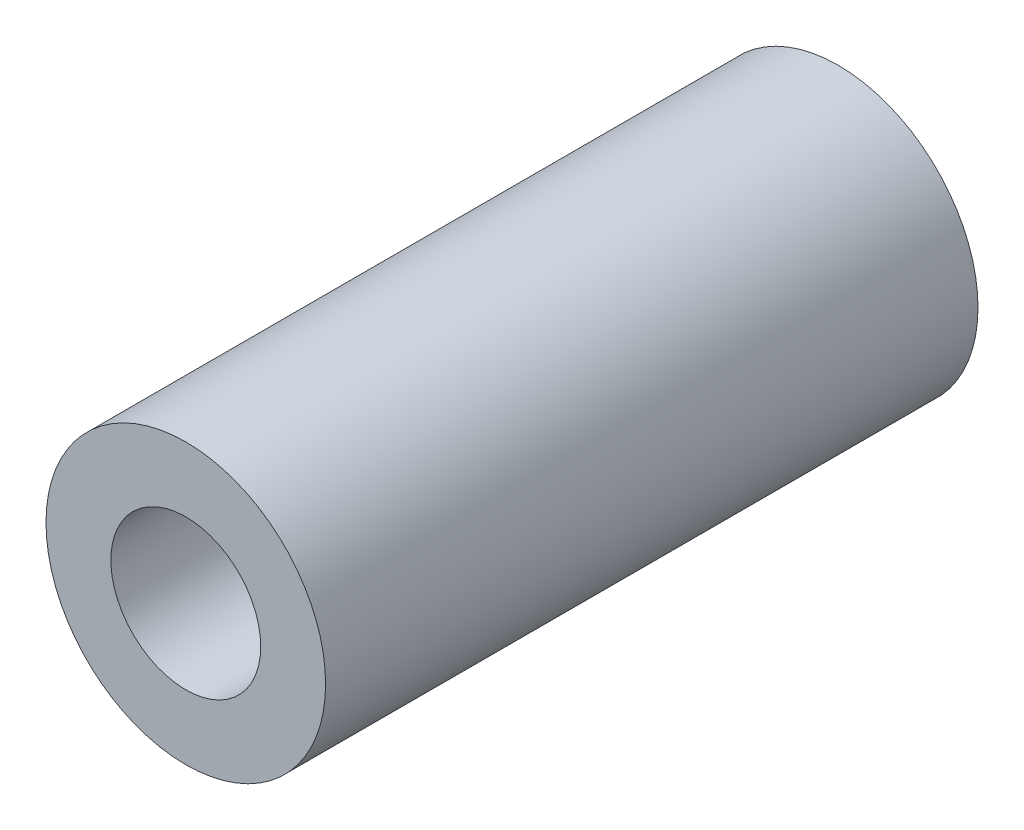
ISO-10303-21;
HEADER;
FILE_DESCRIPTION(('STEP AP214'),'2;1');
FILE_NAME('part.step','',(''),(''),'','','');
FILE_SCHEMA(('AUTOMOTIVE_DESIGN { 1 0 10303 214 1 1 1 1 }'));
ENDSEC;
DATA;
#1=APPLICATION_CONTEXT('core data for automotive mechanical design processes');
#2=APPLICATION_PROTOCOL_DEFINITION('international standard','automotive_design',2000,#1);
#3=PRODUCT_CONTEXT('',#1,'mechanical');
#4=PRODUCT('Part','Part','',(#3));
#5=PRODUCT_RELATED_PRODUCT_CATEGORY('part','',(#4));
#6=PRODUCT_DEFINITION_FORMATION('','',#4);
#7=PRODUCT_DEFINITION_CONTEXT('part definition',#1,'design');
#8=PRODUCT_DEFINITION('design','',#6,#7);
#9=PRODUCT_DEFINITION_SHAPE('','',#8);
#10=(LENGTH_UNIT() NAMED_UNIT(*) SI_UNIT(.MILLI.,.METRE.));
#11=(NAMED_UNIT(*) PLANE_ANGLE_UNIT() SI_UNIT($,.RADIAN.));
#12=(NAMED_UNIT(*) SI_UNIT($,.STERADIAN.) SOLID_ANGLE_UNIT());
#13=UNCERTAINTY_MEASURE_WITH_UNIT(LENGTH_MEASURE(1.E-05),#10,'distance_accuracy_value','');
#14=(GEOMETRIC_REPRESENTATION_CONTEXT(3) GLOBAL_UNCERTAINTY_ASSIGNED_CONTEXT((#13)) GLOBAL_UNIT_ASSIGNED_CONTEXT((#10,
#11,#12)) REPRESENTATION_CONTEXT('',''));
#15=CARTESIAN_POINT('',(0.,0.,0.));
#16=DIRECTION('',(0.,0.,1.));
#17=DIRECTION('',(1.,0.,0.));
#18=AXIS2_PLACEMENT_3D('',#15,#16,#17);
#19=CARTESIAN_POINT('',(0.,0.,22.225));
#20=DIRECTION('',(0.,0.,-1.));
#21=DIRECTION('',(-1.,0.,0.));
#22=AXIS2_PLACEMENT_3D('',#19,#20,#21);
#23=CYLINDRICAL_SURFACE('',#22,4.7625);
#24=CARTESIAN_POINT('',(0.,0.,22.225));
#25=DIRECTION('',(0.,0.,1.));
#26=DIRECTION('',(1.,0.,0.));
#27=AXIS2_PLACEMENT_3D('',#24,#25,#26);
#28=CIRCLE('',#27,4.7625);
#29=CARTESIAN_POINT('',(4.7625,0.,22.225));
#30=VERTEX_POINT('',#29);
#31=EDGE_CURVE('E10',#30,#30,#28,.T.);
#32=ORIENTED_EDGE('',*,*,#31,.F.);
#33=EDGE_LOOP('',(#32));
#34=FACE_BOUND('',#33,.T.);
#35=CARTESIAN_POINT('',(0.,0.,0.));
#36=DIRECTION('',(0.,0.,1.));
#37=DIRECTION('',(1.,0.,0.));
#38=AXIS2_PLACEMENT_3D('',#35,#36,#37);
#39=CIRCLE('',#38,4.7625);
#40=CARTESIAN_POINT('',(4.7625,0.,0.));
#41=VERTEX_POINT('',#40);
#42=EDGE_CURVE('E34',#41,#41,#39,.T.);
#43=ORIENTED_EDGE('',*,*,#42,.T.);
#44=EDGE_LOOP('',(#43));
#45=FACE_BOUND('',#44,.T.);
#46=ADVANCED_FACE('F31',(#34,#45),#23,.T.);
#47=CARTESIAN_POINT('',(0.,0.,22.225));
#48=DIRECTION('',(0.,0.,1.));
#49=DIRECTION('',(1.,0.,0.));
#50=AXIS2_PLACEMENT_3D('',#47,#48,#49);
#51=PLANE('',#50);
#52=CARTESIAN_POINT('',(0.,0.,22.225));
#53=DIRECTION('',(0.,0.,1.));
#54=DIRECTION('',(1.,0.,0.));
#55=AXIS2_PLACEMENT_3D('',#52,#53,#54);
#56=CIRCLE('',#55,2.5527);
#57=CARTESIAN_POINT('',(2.5527,0.,22.225));
#58=VERTEX_POINT('',#57);
#59=EDGE_CURVE('E45',#58,#58,#56,.T.);
#60=ORIENTED_EDGE('',*,*,#59,.F.);
#61=EDGE_LOOP('',(#60));
#62=FACE_BOUND('',#61,.T.);
#63=ORIENTED_EDGE('',*,*,#31,.T.);
#64=EDGE_LOOP('',(#63));
#65=FACE_BOUND('',#64,.T.);
#66=ADVANCED_FACE('F51',(#62,#65),#51,.T.);
#67=CARTESIAN_POINT('',(0.,0.,0.));
#68=DIRECTION('',(0.,0.,1.));
#69=DIRECTION('',(1.,0.,0.));
#70=AXIS2_PLACEMENT_3D('',#67,#68,#69);
#71=PLANE('',#70);
#72=CARTESIAN_POINT('',(0.,0.,0.));
#73=DIRECTION('',(0.,0.,1.));
#74=DIRECTION('',(1.,0.,0.));
#75=AXIS2_PLACEMENT_3D('',#72,#73,#74);
#76=CIRCLE('',#75,2.5527);
#77=CARTESIAN_POINT('',(2.5527,0.,0.));
#78=VERTEX_POINT('',#77);
#79=EDGE_CURVE('E41',#78,#78,#76,.T.);
#80=ORIENTED_EDGE('',*,*,#79,.T.);
#81=EDGE_LOOP('',(#80));
#82=FACE_BOUND('',#81,.T.);
#83=ORIENTED_EDGE('',*,*,#42,.F.);
#84=EDGE_LOOP('',(#83));
#85=FACE_BOUND('',#84,.T.);
#86=ADVANCED_FACE('F53',(#82,#85),#71,.F.);
#87=CARTESIAN_POINT('',(0.,0.,22.225));
#88=DIRECTION('',(0.,0.,1.));
#89=DIRECTION('',(1.,0.,0.));
#90=AXIS2_PLACEMENT_3D('',#87,#88,#89);
#91=CYLINDRICAL_SURFACE('',#90,2.5527);
#92=ORIENTED_EDGE('',*,*,#79,.F.);
#93=EDGE_LOOP('',(#92));
#94=FACE_BOUND('',#93,.T.);
#95=ORIENTED_EDGE('',*,*,#59,.T.);
#96=EDGE_LOOP('',(#95));
#97=FACE_BOUND('',#96,.T.);
#98=ADVANCED_FACE('F49',(#94,#97),#91,.F.);
#99=CLOSED_SHELL('',(#46,#66,#86,#98));
#100=MANIFOLD_SOLID_BREP('B2',#99);
#101=ADVANCED_BREP_SHAPE_REPRESENTATION('',(#18,#100),#14);
#102=SHAPE_DEFINITION_REPRESENTATION(#9,#101);
ENDSEC;
END-ISO-10303-21;
